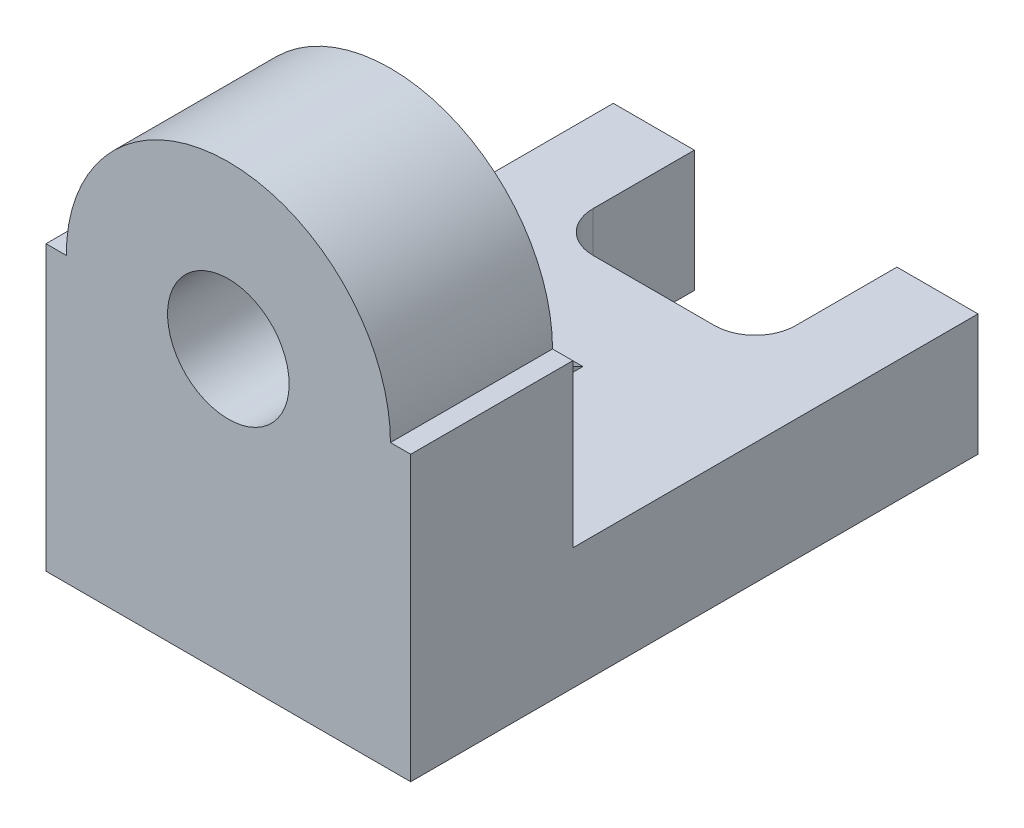
ISO-10303-21;
HEADER;
FILE_DESCRIPTION(('STEP AP214'),'2;1');
FILE_NAME('part.step','',(''),(''),'','','');
FILE_SCHEMA(('AUTOMOTIVE_DESIGN { 1 0 10303 214 1 1 1 1 }'));
ENDSEC;
DATA;
#1=APPLICATION_CONTEXT('core data for automotive mechanical design processes');
#2=APPLICATION_PROTOCOL_DEFINITION('international standard','automotive_design',2000,#1);
#3=PRODUCT_CONTEXT('',#1,'mechanical');
#4=PRODUCT('Part','Part','',(#3));
#5=PRODUCT_RELATED_PRODUCT_CATEGORY('part','',(#4));
#6=PRODUCT_DEFINITION_FORMATION('','',#4);
#7=PRODUCT_DEFINITION_CONTEXT('part definition',#1,'design');
#8=PRODUCT_DEFINITION('design','',#6,#7);
#9=PRODUCT_DEFINITION_SHAPE('','',#8);
#10=(LENGTH_UNIT() NAMED_UNIT(*) SI_UNIT(.MILLI.,.METRE.));
#11=(NAMED_UNIT(*) PLANE_ANGLE_UNIT() SI_UNIT($,.RADIAN.));
#12=(NAMED_UNIT(*) SI_UNIT($,.STERADIAN.) SOLID_ANGLE_UNIT());
#13=UNCERTAINTY_MEASURE_WITH_UNIT(LENGTH_MEASURE(1.E-05),#10,'distance_accuracy_value','');
#14=(GEOMETRIC_REPRESENTATION_CONTEXT(3) GLOBAL_UNCERTAINTY_ASSIGNED_CONTEXT((#13)) GLOBAL_UNIT_ASSIGNED_CONTEXT((#10,
#11,#12)) REPRESENTATION_CONTEXT('',''));
#15=CARTESIAN_POINT('',(0.,0.,0.));
#16=DIRECTION('',(0.,0.,1.));
#17=DIRECTION('',(1.,0.,0.));
#18=AXIS2_PLACEMENT_3D('',#15,#16,#17);
#19=CARTESIAN_POINT('',(0.,70.,-70.));
#20=DIRECTION('',(0.,0.,-1.));
#21=DIRECTION('',(-1.,0.,0.));
#22=AXIS2_PLACEMENT_3D('',#19,#20,#21);
#23=PLANE('',#22);
#24=DIRECTION('',(0.,1.,0.));
#25=VECTOR('',#24,1.);
#26=CARTESIAN_POINT('',(-25.,0.,-70.));
#27=LINE('',#26,#25);
#28=CARTESIAN_POINT('',(-25.,0.,-70.));
#29=VERTEX_POINT('',#28);
#30=CARTESIAN_POINT('',(-25.,30.,-70.));
#31=VERTEX_POINT('',#30);
#32=EDGE_CURVE('E225',#29,#31,#27,.T.);
#33=ORIENTED_EDGE('',*,*,#32,.F.);
#34=DIRECTION('',(1.,0.,0.));
#35=VECTOR('',#34,1.);
#36=CARTESIAN_POINT('',(-45.,0.,-70.));
#37=LINE('',#36,#35);
#38=CARTESIAN_POINT('',(-45.,0.,-70.));
#39=VERTEX_POINT('',#38);
#40=EDGE_CURVE('E291',#39,#29,#37,.T.);
#41=ORIENTED_EDGE('',*,*,#40,.F.);
#42=DIRECTION('',(0.,-1.,0.));
#43=VECTOR('',#42,1.);
#44=CARTESIAN_POINT('',(-45.,70.,-70.));
#45=LINE('',#44,#43);
#46=CARTESIAN_POINT('',(-45.,30.,-70.));
#47=VERTEX_POINT('',#46);
#48=EDGE_CURVE('E287',#47,#39,#45,.T.);
#49=ORIENTED_EDGE('',*,*,#48,.F.);
#50=DIRECTION('',(-1.,0.,0.));
#51=VECTOR('',#50,1.);
#52=CARTESIAN_POINT('',(45.,30.,-70.));
#53=LINE('',#52,#51);
#54=EDGE_CURVE('E240',#31,#47,#53,.T.);
#55=ORIENTED_EDGE('',*,*,#54,.F.);
#56=EDGE_LOOP('',(#33,#41,#49,#55));
#57=FACE_BOUND('',#56,.T.);
#58=ADVANCED_FACE('F45',(#57),#23,.T.);
#59=CARTESIAN_POINT('',(0.,70.,-70.));
#60=DIRECTION('',(0.,0.,1.));
#61=DIRECTION('',(1.,0.,0.));
#62=AXIS2_PLACEMENT_3D('',#59,#60,#61);
#63=CYLINDRICAL_SURFACE('',#62,40.);
#64=CARTESIAN_POINT('',(0.,70.,30.));
#65=DIRECTION('',(0.,0.,1.));
#66=DIRECTION('',(0.,-1.,0.));
#67=AXIS2_PLACEMENT_3D('',#64,#65,#66);
#68=CIRCLE('',#67,40.);
#69=CARTESIAN_POINT('',(-40.,70.,30.));
#70=VERTEX_POINT('',#69);
#71=CARTESIAN_POINT('',(40.,70.,30.));
#72=VERTEX_POINT('',#71);
#73=EDGE_CURVE('E254',#70,#72,#68,.F.);
#74=ORIENTED_EDGE('',*,*,#73,.F.);
#75=DIRECTION('',(0.,0.,1.));
#76=VECTOR('',#75,1.);
#77=CARTESIAN_POINT('',(-40.,70.,-70.));
#78=LINE('',#77,#76);
#79=CARTESIAN_POINT('',(-40.,70.,70.));
#80=VERTEX_POINT('',#79);
#81=EDGE_CURVE('E299',#70,#80,#78,.T.);
#82=ORIENTED_EDGE('',*,*,#81,.T.);
#83=CARTESIAN_POINT('',(0.,70.,70.));
#84=DIRECTION('',(0.,0.,1.));
#85=DIRECTION('',(-1.,0.,0.));
#86=AXIS2_PLACEMENT_3D('',#83,#84,#85);
#87=CIRCLE('',#86,40.);
#88=CARTESIAN_POINT('',(40.,70.,70.));
#89=VERTEX_POINT('',#88);
#90=EDGE_CURVE('E264',#89,#80,#87,.T.);
#91=ORIENTED_EDGE('',*,*,#90,.F.);
#92=DIRECTION('',(0.,0.,1.));
#93=VECTOR('',#92,1.);
#94=CARTESIAN_POINT('',(40.,70.,-70.));
#95=LINE('',#94,#93);
#96=EDGE_CURVE('E300',#72,#89,#95,.T.);
#97=ORIENTED_EDGE('',*,*,#96,.F.);
#98=EDGE_LOOP('',(#74,#82,#91,#97));
#99=FACE_BOUND('',#98,.T.);
#100=ADVANCED_FACE('F396',(#99),#63,.T.);
#101=CARTESIAN_POINT('',(45.,70.,-70.));
#102=DIRECTION('',(0.,1.,0.));
#103=DIRECTION('',(0.,0.,1.));
#104=AXIS2_PLACEMENT_3D('',#101,#102,#103);
#105=PLANE('',#104);
#106=DIRECTION('',(1.,0.,0.));
#107=VECTOR('',#106,1.);
#108=CARTESIAN_POINT('',(45.,70.,30.));
#109=LINE('',#108,#107);
#110=CARTESIAN_POINT('',(45.,70.,30.));
#111=VERTEX_POINT('',#110);
#112=EDGE_CURVE('E257',#72,#111,#109,.T.);
#113=ORIENTED_EDGE('',*,*,#112,.F.);
#114=ORIENTED_EDGE('',*,*,#96,.T.);
#115=DIRECTION('',(-1.,0.,0.));
#116=VECTOR('',#115,1.);
#117=CARTESIAN_POINT('',(45.,70.,70.));
#118=LINE('',#117,#116);
#119=CARTESIAN_POINT('',(45.,70.,70.));
#120=VERTEX_POINT('',#119);
#121=EDGE_CURVE('E283',#120,#89,#118,.T.);
#122=ORIENTED_EDGE('',*,*,#121,.F.);
#123=DIRECTION('',(0.,0.,1.));
#124=VECTOR('',#123,1.);
#125=CARTESIAN_POINT('',(45.,70.,-70.));
#126=LINE('',#125,#124);
#127=EDGE_CURVE('E304',#111,#120,#126,.T.);
#128=ORIENTED_EDGE('',*,*,#127,.F.);
#129=EDGE_LOOP('',(#113,#114,#122,#128));
#130=FACE_BOUND('',#129,.T.);
#131=ADVANCED_FACE('F394',(#130),#105,.T.);
#132=CARTESIAN_POINT('',(45.,0.,-70.));
#133=DIRECTION('',(1.,0.,0.));
#134=DIRECTION('',(0.,1.,0.));
#135=AXIS2_PLACEMENT_3D('',#132,#133,#134);
#136=PLANE('',#135);
#137=DIRECTION('',(0.,1.,0.));
#138=VECTOR('',#137,1.);
#139=CARTESIAN_POINT('',(45.,110.,30.));
#140=LINE('',#139,#138);
#141=CARTESIAN_POINT('',(45.,30.,30.));
#142=VERTEX_POINT('',#141);
#143=EDGE_CURVE('E235',#142,#111,#140,.T.);
#144=ORIENTED_EDGE('',*,*,#143,.T.);
#145=ORIENTED_EDGE('',*,*,#127,.T.);
#146=DIRECTION('',(0.,1.,0.));
#147=VECTOR('',#146,1.);
#148=CARTESIAN_POINT('',(45.,0.,70.));
#149=LINE('',#148,#147);
#150=CARTESIAN_POINT('',(45.,0.,70.));
#151=VERTEX_POINT('',#150);
#152=EDGE_CURVE('E279',#151,#120,#149,.T.);
#153=ORIENTED_EDGE('',*,*,#152,.F.);
#154=DIRECTION('',(0.,0.,1.));
#155=VECTOR('',#154,1.);
#156=CARTESIAN_POINT('',(45.,0.,-70.));
#157=LINE('',#156,#155);
#158=CARTESIAN_POINT('',(45.,0.,-70.));
#159=VERTEX_POINT('',#158);
#160=EDGE_CURVE('E307',#159,#151,#157,.T.);
#161=ORIENTED_EDGE('',*,*,#160,.F.);
#162=DIRECTION('',(0.,1.,0.));
#163=VECTOR('',#162,1.);
#164=CARTESIAN_POINT('',(45.,0.,-70.));
#165=LINE('',#164,#163);
#166=CARTESIAN_POINT('',(45.,30.,-70.));
#167=VERTEX_POINT('',#166);
#168=EDGE_CURVE('E295',#159,#167,#165,.T.);
#169=ORIENTED_EDGE('',*,*,#168,.T.);
#170=DIRECTION('',(0.,0.,1.));
#171=VECTOR('',#170,1.);
#172=CARTESIAN_POINT('',(45.,30.,-70.));
#173=LINE('',#172,#171);
#174=EDGE_CURVE('E231',#167,#142,#173,.T.);
#175=ORIENTED_EDGE('',*,*,#174,.T.);
#176=EDGE_LOOP('',(#144,#145,#153,#161,#169,#175));
#177=FACE_BOUND('',#176,.T.);
#178=ADVANCED_FACE('F402',(#177),#136,.T.);
#179=CARTESIAN_POINT('',(-45.,0.,-70.));
#180=DIRECTION('',(0.,-1.,0.));
#181=DIRECTION('',(1.,0.,0.));
#182=AXIS2_PLACEMENT_3D('',#179,#180,#181);
#183=PLANE('',#182);
#184=ORIENTED_EDGE('',*,*,#160,.T.);
#185=DIRECTION('',(1.,0.,0.));
#186=VECTOR('',#185,1.);
#187=CARTESIAN_POINT('',(-45.,0.,70.));
#188=LINE('',#187,#186);
#189=CARTESIAN_POINT('',(-45.,0.,70.));
#190=VERTEX_POINT('',#189);
#191=EDGE_CURVE('E276',#190,#151,#188,.T.);
#192=ORIENTED_EDGE('',*,*,#191,.F.);
#193=DIRECTION('',(0.,0.,1.));
#194=VECTOR('',#193,1.);
#195=CARTESIAN_POINT('',(-45.,0.,-70.));
#196=LINE('',#195,#194);
#197=EDGE_CURVE('E311',#39,#190,#196,.T.);
#198=ORIENTED_EDGE('',*,*,#197,.F.);
#199=ORIENTED_EDGE('',*,*,#40,.T.);
#200=DIRECTION('',(0.,0.,1.));
#201=VECTOR('',#200,1.);
#202=CARTESIAN_POINT('',(-25.,0.,-70.));
#203=LINE('',#202,#201);
#204=CARTESIAN_POINT('',(-25.,0.,-45.));
#205=VERTEX_POINT('',#204);
#206=EDGE_CURVE('E204',#29,#205,#203,.T.);
#207=ORIENTED_EDGE('',*,*,#206,.T.);
#208=CARTESIAN_POINT('',(-15.,0.,-45.));
#209=DIRECTION('',(0.,-1.,0.));
#210=DIRECTION('',(1.,0.,0.));
#211=AXIS2_PLACEMENT_3D('',#208,#209,#210);
#212=CIRCLE('',#211,10.);
#213=CARTESIAN_POINT('',(-15.,0.,-35.));
#214=VERTEX_POINT('',#213);
#215=EDGE_CURVE('E339',#205,#214,#212,.F.);
#216=ORIENTED_EDGE('',*,*,#215,.T.);
#217=DIRECTION('',(1.,0.,0.));
#218=VECTOR('',#217,1.);
#219=CARTESIAN_POINT('',(-25.,0.,-35.));
#220=LINE('',#219,#218);
#221=CARTESIAN_POINT('',(15.,0.,-35.));
#222=VERTEX_POINT('',#221);
#223=EDGE_CURVE('E208',#214,#222,#220,.T.);
#224=ORIENTED_EDGE('',*,*,#223,.T.);
#225=CARTESIAN_POINT('',(15.,0.,-45.));
#226=DIRECTION('',(0.,-1.,0.));
#227=DIRECTION('',(1.,0.,0.));
#228=AXIS2_PLACEMENT_3D('',#225,#226,#227);
#229=CIRCLE('',#228,10.);
#230=CARTESIAN_POINT('',(25.,0.,-45.));
#231=VERTEX_POINT('',#230);
#232=EDGE_CURVE('E11',#222,#231,#229,.F.);
#233=ORIENTED_EDGE('',*,*,#232,.T.);
#234=DIRECTION('',(0.,0.,-1.));
#235=VECTOR('',#234,1.);
#236=CARTESIAN_POINT('',(25.,0.,-70.));
#237=LINE('',#236,#235);
#238=CARTESIAN_POINT('',(25.,0.,-70.));
#239=VERTEX_POINT('',#238);
#240=EDGE_CURVE('E212',#231,#239,#237,.T.);
#241=ORIENTED_EDGE('',*,*,#240,.T.);
#242=EDGE_CURVE('E290',#239,#159,#37,.T.);
#243=ORIENTED_EDGE('',*,*,#242,.T.);
#244=EDGE_LOOP('',(#184,#192,#198,#199,#207,#216,#224,#233,#241,#243));
#245=FACE_BOUND('',#244,.T.);
#246=ADVANCED_FACE('F354',(#245),#183,.T.);
#247=CARTESIAN_POINT('',(-45.,70.,-70.));
#248=DIRECTION('',(-1.,0.,0.));
#249=DIRECTION('',(0.,-1.,0.));
#250=AXIS2_PLACEMENT_3D('',#247,#248,#249);
#251=PLANE('',#250);
#252=DIRECTION('',(0.,1.,0.));
#253=VECTOR('',#252,1.);
#254=CARTESIAN_POINT('',(-45.,110.,30.));
#255=LINE('',#254,#253);
#256=CARTESIAN_POINT('',(-45.,30.,30.));
#257=VERTEX_POINT('',#256);
#258=CARTESIAN_POINT('',(-45.,70.,30.));
#259=VERTEX_POINT('',#258);
#260=EDGE_CURVE('E236',#257,#259,#255,.T.);
#261=ORIENTED_EDGE('',*,*,#260,.F.);
#262=DIRECTION('',(0.,0.,1.));
#263=VECTOR('',#262,1.);
#264=CARTESIAN_POINT('',(-45.,30.,-70.));
#265=LINE('',#264,#263);
#266=EDGE_CURVE('E169',#47,#257,#265,.T.);
#267=ORIENTED_EDGE('',*,*,#266,.F.);
#268=ORIENTED_EDGE('',*,*,#48,.T.);
#269=ORIENTED_EDGE('',*,*,#197,.T.);
#270=DIRECTION('',(0.,-1.,0.));
#271=VECTOR('',#270,1.);
#272=CARTESIAN_POINT('',(-45.,70.,70.));
#273=LINE('',#272,#271);
#274=CARTESIAN_POINT('',(-45.,70.,70.));
#275=VERTEX_POINT('',#274);
#276=EDGE_CURVE('E272',#275,#190,#273,.T.);
#277=ORIENTED_EDGE('',*,*,#276,.F.);
#278=DIRECTION('',(0.,0.,1.));
#279=VECTOR('',#278,1.);
#280=CARTESIAN_POINT('',(-45.,70.,-70.));
#281=LINE('',#280,#279);
#282=EDGE_CURVE('E314',#259,#275,#281,.T.);
#283=ORIENTED_EDGE('',*,*,#282,.F.);
#284=EDGE_LOOP('',(#261,#267,#268,#269,#277,#283));
#285=FACE_BOUND('',#284,.T.);
#286=ADVANCED_FACE('F372',(#285),#251,.T.);
#287=CARTESIAN_POINT('',(-40.,70.,-70.));
#288=DIRECTION('',(0.,1.,0.));
#289=DIRECTION('',(0.,0.,1.));
#290=AXIS2_PLACEMENT_3D('',#287,#288,#289);
#291=PLANE('',#290);
#292=DIRECTION('',(1.,0.,0.));
#293=VECTOR('',#292,1.);
#294=CARTESIAN_POINT('',(-40.,70.,30.));
#295=LINE('',#294,#293);
#296=EDGE_CURVE('E250',#259,#70,#295,.T.);
#297=ORIENTED_EDGE('',*,*,#296,.F.);
#298=ORIENTED_EDGE('',*,*,#282,.T.);
#299=DIRECTION('',(-1.,0.,0.));
#300=VECTOR('',#299,1.);
#301=CARTESIAN_POINT('',(-40.,70.,70.));
#302=LINE('',#301,#300);
#303=EDGE_CURVE('E268',#80,#275,#302,.T.);
#304=ORIENTED_EDGE('',*,*,#303,.F.);
#305=ORIENTED_EDGE('',*,*,#81,.F.);
#306=EDGE_LOOP('',(#297,#298,#304,#305));
#307=FACE_BOUND('',#306,.T.);
#308=ADVANCED_FACE('F387',(#307),#291,.T.);
#309=DIRECTION('',(0.,1.,0.));
#310=VECTOR('',#309,1.);
#311=CARTESIAN_POINT('',(25.,0.,-70.));
#312=LINE('',#311,#310);
#313=CARTESIAN_POINT('',(25.,30.,-70.));
#314=VERTEX_POINT('',#313);
#315=EDGE_CURVE('E215',#239,#314,#312,.T.);
#316=ORIENTED_EDGE('',*,*,#315,.T.);
#317=EDGE_CURVE('E173',#167,#314,#53,.T.);
#318=ORIENTED_EDGE('',*,*,#317,.F.);
#319=ORIENTED_EDGE('',*,*,#168,.F.);
#320=ORIENTED_EDGE('',*,*,#242,.F.);
#321=EDGE_LOOP('',(#316,#318,#319,#320));
#322=FACE_BOUND('',#321,.T.);
#323=ADVANCED_FACE('F362',(#322),#23,.T.);
#324=CARTESIAN_POINT('',(0.,70.,-70.));
#325=DIRECTION('',(0.,0.,1.));
#326=DIRECTION('',(1.,0.,0.));
#327=AXIS2_PLACEMENT_3D('',#324,#325,#326);
#328=CYLINDRICAL_SURFACE('',#327,15.);
#329=CARTESIAN_POINT('',(0.,70.,70.));
#330=DIRECTION('',(0.,0.,1.));
#331=DIRECTION('',(1.,0.,0.));
#332=AXIS2_PLACEMENT_3D('',#329,#330,#331);
#333=CIRCLE('',#332,15.);
#334=CARTESIAN_POINT('',(15.,70.,70.));
#335=VERTEX_POINT('',#334);
#336=EDGE_CURVE('E260',#335,#335,#333,.T.);
#337=ORIENTED_EDGE('',*,*,#336,.T.);
#338=EDGE_LOOP('',(#337));
#339=FACE_BOUND('',#338,.T.);
#340=CARTESIAN_POINT('',(0.,70.,30.));
#341=DIRECTION('',(0.,0.,1.));
#342=DIRECTION('',(0.,-1.,0.));
#343=AXIS2_PLACEMENT_3D('',#340,#341,#342);
#344=CIRCLE('',#343,15.);
#345=CARTESIAN_POINT('',(0.,55.,30.));
#346=VERTEX_POINT('',#345);
#347=EDGE_CURVE('E246',#346,#346,#344,.F.);
#348=ORIENTED_EDGE('',*,*,#347,.T.);
#349=EDGE_LOOP('',(#348));
#350=FACE_BOUND('',#349,.T.);
#351=ADVANCED_FACE('F434',(#339,#350),#328,.F.);
#352=CARTESIAN_POINT('',(0.,70.,70.));
#353=DIRECTION('',(0.,0.,-1.));
#354=DIRECTION('',(-1.,0.,0.));
#355=AXIS2_PLACEMENT_3D('',#352,#353,#354);
#356=PLANE('',#355);
#357=ORIENTED_EDGE('',*,*,#191,.T.);
#358=ORIENTED_EDGE('',*,*,#152,.T.);
#359=ORIENTED_EDGE('',*,*,#121,.T.);
#360=ORIENTED_EDGE('',*,*,#90,.T.);
#361=ORIENTED_EDGE('',*,*,#303,.T.);
#362=ORIENTED_EDGE('',*,*,#276,.T.);
#363=EDGE_LOOP('',(#357,#358,#359,#360,#361,#362));
#364=FACE_BOUND('',#363,.T.);
#365=ORIENTED_EDGE('',*,*,#336,.F.);
#366=EDGE_LOOP('',(#365));
#367=FACE_BOUND('',#366,.T.);
#368=ADVANCED_FACE('F380',(#364,#367),#356,.F.);
#369=CARTESIAN_POINT('',(45.,110.,30.));
#370=DIRECTION('',(0.,0.,1.));
#371=DIRECTION('',(0.,-1.,0.));
#372=AXIS2_PLACEMENT_3D('',#369,#370,#371);
#373=PLANE('',#372);
#374=DIRECTION('',(-1.,0.,0.));
#375=VECTOR('',#374,1.);
#376=CARTESIAN_POINT('',(45.,30.,30.));
#377=LINE('',#376,#375);
#378=CARTESIAN_POINT('',(7.5,30.,30.));
#379=VERTEX_POINT('',#378);
#380=EDGE_CURVE('E172',#142,#379,#377,.T.);
#381=ORIENTED_EDGE('',*,*,#380,.T.);
#382=DIRECTION('',(0.,1.,0.));
#383=VECTOR('',#382,1.);
#384=CARTESIAN_POINT('',(7.5,110.,30.));
#385=LINE('',#384,#383);
#386=CARTESIAN_POINT('',(7.5,50.,30.));
#387=VERTEX_POINT('',#386);
#388=EDGE_CURVE('E61',#379,#387,#385,.T.);
#389=ORIENTED_EDGE('',*,*,#388,.T.);
#390=DIRECTION('',(1.,0.,0.));
#391=VECTOR('',#390,1.);
#392=CARTESIAN_POINT('',(45.,50.,30.));
#393=LINE('',#392,#391);
#394=CARTESIAN_POINT('',(-7.5,50.,30.));
#395=VERTEX_POINT('',#394);
#396=EDGE_CURVE('E65',#387,#395,#393,.F.);
#397=ORIENTED_EDGE('',*,*,#396,.T.);
#398=DIRECTION('',(0.,1.,0.));
#399=VECTOR('',#398,1.);
#400=CARTESIAN_POINT('',(-7.5,110.,30.));
#401=LINE('',#400,#399);
#402=CARTESIAN_POINT('',(-7.5,30.,30.));
#403=VERTEX_POINT('',#402);
#404=EDGE_CURVE('E175',#403,#395,#401,.T.);
#405=ORIENTED_EDGE('',*,*,#404,.F.);
#406=EDGE_CURVE('E163',#403,#257,#377,.T.);
#407=ORIENTED_EDGE('',*,*,#406,.T.);
#408=ORIENTED_EDGE('',*,*,#260,.T.);
#409=ORIENTED_EDGE('',*,*,#296,.T.);
#410=ORIENTED_EDGE('',*,*,#73,.T.);
#411=ORIENTED_EDGE('',*,*,#112,.T.);
#412=ORIENTED_EDGE('',*,*,#143,.F.);
#413=EDGE_LOOP('',(#381,#389,#397,#405,#407,#408,#409,#410,#411,#412));
#414=FACE_BOUND('',#413,.T.);
#415=ORIENTED_EDGE('',*,*,#347,.F.);
#416=EDGE_LOOP('',(#415));
#417=FACE_BOUND('',#416,.T.);
#418=ADVANCED_FACE('F176',(#414,#417),#373,.F.);
#419=CARTESIAN_POINT('',(45.,30.,-70.));
#420=DIRECTION('',(0.,-1.,0.));
#421=DIRECTION('',(1.,0.,0.));
#422=AXIS2_PLACEMENT_3D('',#419,#420,#421);
#423=PLANE('',#422);
#424=DIRECTION('',(-1.,0.,0.));
#425=VECTOR('',#424,1.);
#426=CARTESIAN_POINT('',(45.,30.,-9.99999999999998));
#427=LINE('',#426,#425);
#428=CARTESIAN_POINT('',(-7.5,30.,-9.99999999999997));
#429=VERTEX_POINT('',#428);
#430=CARTESIAN_POINT('',(7.5,30.,-9.99999999999999));
#431=VERTEX_POINT('',#430);
#432=EDGE_CURVE('E198',#429,#431,#427,.F.);
#433=ORIENTED_EDGE('',*,*,#432,.T.);
#434=DIRECTION('',(0.,0.,1.));
#435=VECTOR('',#434,1.);
#436=CARTESIAN_POINT('',(7.5,30.,-70.));
#437=LINE('',#436,#435);
#438=EDGE_CURVE('E182',#431,#379,#437,.T.);
#439=ORIENTED_EDGE('',*,*,#438,.T.);
#440=ORIENTED_EDGE('',*,*,#380,.F.);
#441=ORIENTED_EDGE('',*,*,#174,.F.);
#442=ORIENTED_EDGE('',*,*,#317,.T.);
#443=DIRECTION('',(0.,0.,-1.));
#444=VECTOR('',#443,1.);
#445=CARTESIAN_POINT('',(25.,30.,-70.));
#446=LINE('',#445,#444);
#447=CARTESIAN_POINT('',(25.,30.,-45.));
#448=VERTEX_POINT('',#447);
#449=EDGE_CURVE('E209',#448,#314,#446,.T.);
#450=ORIENTED_EDGE('',*,*,#449,.F.);
#451=CARTESIAN_POINT('',(15.,30.,-45.));
#452=DIRECTION('',(0.,-1.,0.));
#453=DIRECTION('',(1.,0.,0.));
#454=AXIS2_PLACEMENT_3D('',#451,#452,#453);
#455=CIRCLE('',#454,10.);
#456=CARTESIAN_POINT('',(15.,30.,-35.));
#457=VERTEX_POINT('',#456);
#458=EDGE_CURVE('E54',#448,#457,#455,.T.);
#459=ORIENTED_EDGE('',*,*,#458,.T.);
#460=DIRECTION('',(1.,0.,0.));
#461=VECTOR('',#460,1.);
#462=CARTESIAN_POINT('',(-25.,30.,-35.));
#463=LINE('',#462,#461);
#464=CARTESIAN_POINT('',(-15.,30.,-35.));
#465=VERTEX_POINT('',#464);
#466=EDGE_CURVE('E219',#465,#457,#463,.T.);
#467=ORIENTED_EDGE('',*,*,#466,.F.);
#468=CARTESIAN_POINT('',(-15.,30.,-45.));
#469=DIRECTION('',(0.,-1.,0.));
#470=DIRECTION('',(1.,0.,0.));
#471=AXIS2_PLACEMENT_3D('',#468,#469,#470);
#472=CIRCLE('',#471,10.);
#473=CARTESIAN_POINT('',(-25.,30.,-45.));
#474=VERTEX_POINT('',#473);
#475=EDGE_CURVE('E336',#465,#474,#472,.T.);
#476=ORIENTED_EDGE('',*,*,#475,.T.);
#477=DIRECTION('',(0.,0.,1.));
#478=VECTOR('',#477,1.);
#479=CARTESIAN_POINT('',(-25.,30.,-70.));
#480=LINE('',#479,#478);
#481=EDGE_CURVE('E203',#31,#474,#480,.T.);
#482=ORIENTED_EDGE('',*,*,#481,.F.);
#483=ORIENTED_EDGE('',*,*,#54,.T.);
#484=ORIENTED_EDGE('',*,*,#266,.T.);
#485=ORIENTED_EDGE('',*,*,#406,.F.);
#486=DIRECTION('',(0.,0.,1.));
#487=VECTOR('',#486,1.);
#488=CARTESIAN_POINT('',(-7.5,30.,-70.));
#489=LINE('',#488,#487);
#490=EDGE_CURVE('E166',#429,#403,#489,.T.);
#491=ORIENTED_EDGE('',*,*,#490,.F.);
#492=EDGE_LOOP('',(#433,#439,#440,#441,#442,#450,#459,#467,#476,#482,#483,#484,#485,#491));
#493=FACE_BOUND('',#492,.T.);
#494=ADVANCED_FACE('F164',(#493),#423,.F.);
#495=CARTESIAN_POINT('',(-25.,0.,-70.));
#496=DIRECTION('',(-1.,0.,0.));
#497=DIRECTION('',(0.,0.,1.));
#498=AXIS2_PLACEMENT_3D('',#495,#496,#497);
#499=PLANE('',#498);
#500=ORIENTED_EDGE('',*,*,#481,.T.);
#501=DIRECTION('',(0.,1.,0.));
#502=VECTOR('',#501,1.);
#503=CARTESIAN_POINT('',(-25.,0.,-45.));
#504=LINE('',#503,#502);
#505=EDGE_CURVE('E329',#474,#205,#504,.F.);
#506=ORIENTED_EDGE('',*,*,#505,.T.);
#507=ORIENTED_EDGE('',*,*,#206,.F.);
#508=ORIENTED_EDGE('',*,*,#32,.T.);
#509=EDGE_LOOP('',(#500,#506,#507,#508));
#510=FACE_BOUND('',#509,.T.);
#511=ADVANCED_FACE('F420',(#510),#499,.F.);
#512=CARTESIAN_POINT('',(25.,0.,-70.));
#513=DIRECTION('',(1.,0.,0.));
#514=DIRECTION('',(0.,0.,-1.));
#515=AXIS2_PLACEMENT_3D('',#512,#513,#514);
#516=PLANE('',#515);
#517=ORIENTED_EDGE('',*,*,#240,.F.);
#518=DIRECTION('',(0.,1.,0.));
#519=VECTOR('',#518,1.);
#520=CARTESIAN_POINT('',(25.,30.,-45.));
#521=LINE('',#520,#519);
#522=EDGE_CURVE('E332',#231,#448,#521,.T.);
#523=ORIENTED_EDGE('',*,*,#522,.T.);
#524=ORIENTED_EDGE('',*,*,#449,.T.);
#525=ORIENTED_EDGE('',*,*,#315,.F.);
#526=EDGE_LOOP('',(#517,#523,#524,#525));
#527=FACE_BOUND('',#526,.T.);
#528=ADVANCED_FACE('F357',(#527),#516,.F.);
#529=CARTESIAN_POINT('',(-25.,0.,-35.));
#530=DIRECTION('',(0.,0.,1.));
#531=DIRECTION('',(1.,0.,0.));
#532=AXIS2_PLACEMENT_3D('',#529,#530,#531);
#533=PLANE('',#532);
#534=DIRECTION('',(0.,1.,0.));
#535=VECTOR('',#534,1.);
#536=CARTESIAN_POINT('',(15.,0.,-35.));
#537=LINE('',#536,#535);
#538=EDGE_CURVE('E303',#457,#222,#537,.F.);
#539=ORIENTED_EDGE('',*,*,#538,.T.);
#540=ORIENTED_EDGE('',*,*,#223,.F.);
#541=DIRECTION('',(0.,1.,0.));
#542=VECTOR('',#541,1.);
#543=CARTESIAN_POINT('',(-15.,30.,-35.));
#544=LINE('',#543,#542);
#545=EDGE_CURVE('E325',#214,#465,#544,.T.);
#546=ORIENTED_EDGE('',*,*,#545,.T.);
#547=ORIENTED_EDGE('',*,*,#466,.T.);
#548=EDGE_LOOP('',(#539,#540,#546,#547));
#549=FACE_BOUND('',#548,.T.);
#550=ADVANCED_FACE('F348',(#549),#533,.F.);
#551=CARTESIAN_POINT('',(-15.,0.,-45.));
#552=DIRECTION('',(0.,-1.,0.));
#553=DIRECTION('',(1.,0.,0.));
#554=AXIS2_PLACEMENT_3D('',#551,#552,#553);
#555=CYLINDRICAL_SURFACE('',#554,10.);
#556=ORIENTED_EDGE('',*,*,#215,.F.);
#557=ORIENTED_EDGE('',*,*,#505,.F.);
#558=ORIENTED_EDGE('',*,*,#475,.F.);
#559=ORIENTED_EDGE('',*,*,#545,.F.);
#560=EDGE_LOOP('',(#556,#557,#558,#559));
#561=FACE_BOUND('',#560,.T.);
#562=ADVANCED_FACE('F408',(#561),#555,.F.);
#563=CARTESIAN_POINT('',(15.,0.,-45.));
#564=DIRECTION('',(0.,-1.,0.));
#565=DIRECTION('',(1.,0.,0.));
#566=AXIS2_PLACEMENT_3D('',#563,#564,#565);
#567=CYLINDRICAL_SURFACE('',#566,10.);
#568=ORIENTED_EDGE('',*,*,#232,.F.);
#569=ORIENTED_EDGE('',*,*,#538,.F.);
#570=ORIENTED_EDGE('',*,*,#458,.F.);
#571=ORIENTED_EDGE('',*,*,#522,.F.);
#572=EDGE_LOOP('',(#568,#569,#570,#571));
#573=FACE_BOUND('',#572,.T.);
#574=ADVANCED_FACE('F47',(#573),#567,.F.);
#575=CARTESIAN_POINT('',(0.,50.,30.));
#576=DIRECTION('',(0.,-0.894427190999916,0.447213595499958));
#577=DIRECTION('',(0.,-0.447213595499958,-0.894427190999916));
#578=AXIS2_PLACEMENT_3D('',#575,#576,#577);
#579=PLANE('',#578);
#580=ORIENTED_EDGE('',*,*,#396,.F.);
#581=DIRECTION('',(0.,-0.447213595499958,-0.894427190999916));
#582=VECTOR('',#581,1.);
#583=CARTESIAN_POINT('',(7.5,50.,30.));
#584=LINE('',#583,#582);
#585=EDGE_CURVE('E187',#387,#431,#584,.T.);
#586=ORIENTED_EDGE('',*,*,#585,.T.);
#587=ORIENTED_EDGE('',*,*,#432,.F.);
#588=DIRECTION('',(0.,-0.447213595499958,-0.894427190999916));
#589=VECTOR('',#588,1.);
#590=CARTESIAN_POINT('',(-7.5,50.,30.));
#591=LINE('',#590,#589);
#592=EDGE_CURVE('E185',#395,#429,#591,.T.);
#593=ORIENTED_EDGE('',*,*,#592,.F.);
#594=EDGE_LOOP('',(#580,#586,#587,#593));
#595=FACE_BOUND('',#594,.T.);
#596=ADVANCED_FACE('F415',(#595),#579,.F.);
#597=CARTESIAN_POINT('',(7.5,55.,0.));
#598=DIRECTION('',(1.,0.,0.));
#599=DIRECTION('',(0.,0.,-1.));
#600=AXIS2_PLACEMENT_3D('',#597,#598,#599);
#601=PLANE('',#600);
#602=ORIENTED_EDGE('',*,*,#388,.F.);
#603=ORIENTED_EDGE('',*,*,#438,.F.);
#604=ORIENTED_EDGE('',*,*,#585,.F.);
#605=EDGE_LOOP('',(#602,#603,#604));
#606=FACE_BOUND('',#605,.T.);
#607=ADVANCED_FACE('F519',(#606),#601,.T.);
#608=CARTESIAN_POINT('',(-7.5,55.,0.));
#609=DIRECTION('',(1.,0.,0.));
#610=DIRECTION('',(0.,0.,-1.));
#611=AXIS2_PLACEMENT_3D('',#608,#609,#610);
#612=PLANE('',#611);
#613=ORIENTED_EDGE('',*,*,#490,.T.);
#614=ORIENTED_EDGE('',*,*,#404,.T.);
#615=ORIENTED_EDGE('',*,*,#592,.T.);
#616=EDGE_LOOP('',(#613,#614,#615));
#617=FACE_BOUND('',#616,.T.);
#618=ADVANCED_FACE('F184',(#617),#612,.F.);
#619=CLOSED_SHELL('',(#58,#100,#131,#178,#246,#286,#308,#323,#351,#368,#418,#494,#511,#528,#550,
#562,#574,#596,#607,#618));
#620=MANIFOLD_SOLID_BREP('B2',#619);
#621=ADVANCED_BREP_SHAPE_REPRESENTATION('',(#18,#620),#14);
#622=SHAPE_DEFINITION_REPRESENTATION(#9,#621);
ENDSEC;
END-ISO-10303-21;
